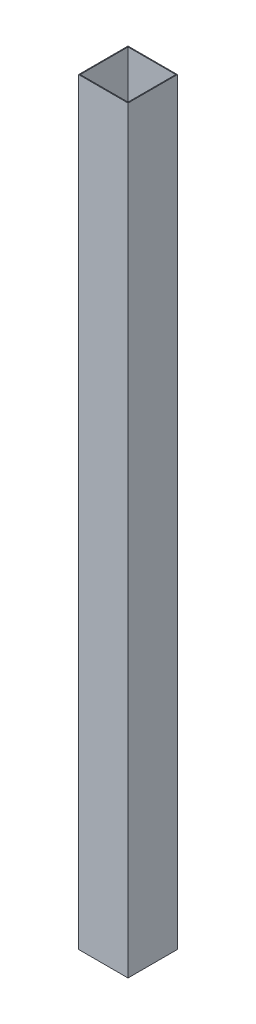
ISO-10303-21;
HEADER;
FILE_DESCRIPTION(('STEP AP214'),'2;1');
FILE_NAME('part.step','',(''),(''),'','','');
FILE_SCHEMA(('AUTOMOTIVE_DESIGN { 1 0 10303 214 1 1 1 1 }'));
ENDSEC;
DATA;
#1=APPLICATION_CONTEXT('core data for automotive mechanical design processes');
#2=APPLICATION_PROTOCOL_DEFINITION('international standard','automotive_design',2000,#1);
#3=PRODUCT_CONTEXT('',#1,'mechanical');
#4=PRODUCT('Part','Part','',(#3));
#5=PRODUCT_RELATED_PRODUCT_CATEGORY('part','',(#4));
#6=PRODUCT_DEFINITION_FORMATION('','',#4);
#7=PRODUCT_DEFINITION_CONTEXT('part definition',#1,'design');
#8=PRODUCT_DEFINITION('design','',#6,#7);
#9=PRODUCT_DEFINITION_SHAPE('','',#8);
#10=(LENGTH_UNIT() NAMED_UNIT(*) SI_UNIT(.MILLI.,.METRE.));
#11=(NAMED_UNIT(*) PLANE_ANGLE_UNIT() SI_UNIT($,.RADIAN.));
#12=(NAMED_UNIT(*) SI_UNIT($,.STERADIAN.) SOLID_ANGLE_UNIT());
#13=UNCERTAINTY_MEASURE_WITH_UNIT(LENGTH_MEASURE(1.E-05),#10,'distance_accuracy_value','');
#14=(GEOMETRIC_REPRESENTATION_CONTEXT(3) GLOBAL_UNCERTAINTY_ASSIGNED_CONTEXT((#13)) GLOBAL_UNIT_ASSIGNED_CONTEXT((#10,
#11,#12)) REPRESENTATION_CONTEXT('',''));
#15=CARTESIAN_POINT('',(0.,0.,0.));
#16=DIRECTION('',(0.,0.,1.));
#17=DIRECTION('',(1.,0.,0.));
#18=AXIS2_PLACEMENT_3D('',#15,#16,#17);
#19=CARTESIAN_POINT('',(0.,0.,0.));
#20=DIRECTION('',(0.,1.,0.));
#21=DIRECTION('',(0.,0.,1.));
#22=AXIS2_PLACEMENT_3D('',#19,#20,#21);
#23=PLANE('',#22);
#24=DIRECTION('',(0.,0.,-1.));
#25=VECTOR('',#24,1.);
#26=CARTESIAN_POINT('',(76.2,0.,-76.2));
#27=LINE('',#26,#25);
#28=CARTESIAN_POINT('',(76.2,0.,76.2));
#29=VERTEX_POINT('',#28);
#30=CARTESIAN_POINT('',(76.2,0.,-76.2));
#31=VERTEX_POINT('',#30);
#32=EDGE_CURVE('E145',#29,#31,#27,.T.);
#33=ORIENTED_EDGE('',*,*,#32,.F.);
#34=DIRECTION('',(1.,0.,0.));
#35=VECTOR('',#34,1.);
#36=CARTESIAN_POINT('',(-76.2,0.,76.2));
#37=LINE('',#36,#35);
#38=CARTESIAN_POINT('',(-76.2,0.,76.2));
#39=VERTEX_POINT('',#38);
#40=EDGE_CURVE('E136',#39,#29,#37,.T.);
#41=ORIENTED_EDGE('',*,*,#40,.F.);
#42=DIRECTION('',(0.,0.,1.));
#43=VECTOR('',#42,1.);
#44=CARTESIAN_POINT('',(-76.2,0.,-76.2));
#45=LINE('',#44,#43);
#46=CARTESIAN_POINT('',(-76.2,0.,-76.2));
#47=VERTEX_POINT('',#46);
#48=EDGE_CURVE('E140',#47,#39,#45,.T.);
#49=ORIENTED_EDGE('',*,*,#48,.F.);
#50=DIRECTION('',(-1.,0.,0.));
#51=VECTOR('',#50,1.);
#52=CARTESIAN_POINT('',(-76.2,0.,-76.2));
#53=LINE('',#52,#51);
#54=EDGE_CURVE('E125',#31,#47,#53,.T.);
#55=ORIENTED_EDGE('',*,*,#54,.F.);
#56=EDGE_LOOP('',(#33,#41,#49,#55));
#57=FACE_BOUND('',#56,.T.);
#58=DIRECTION('',(0.,0.,1.));
#59=VECTOR('',#58,1.);
#60=CARTESIAN_POINT('',(-73.66,0.,-73.66));
#61=LINE('',#60,#59);
#62=CARTESIAN_POINT('',(-73.66,0.,-73.66));
#63=VERTEX_POINT('',#62);
#64=CARTESIAN_POINT('',(-73.66,0.,73.66));
#65=VERTEX_POINT('',#64);
#66=EDGE_CURVE('E173',#63,#65,#61,.T.);
#67=ORIENTED_EDGE('',*,*,#66,.T.);
#68=DIRECTION('',(1.,0.,0.));
#69=VECTOR('',#68,1.);
#70=CARTESIAN_POINT('',(-73.66,0.,73.66));
#71=LINE('',#70,#69);
#72=CARTESIAN_POINT('',(73.66,0.,73.66));
#73=VERTEX_POINT('',#72);
#74=EDGE_CURVE('E169',#65,#73,#71,.T.);
#75=ORIENTED_EDGE('',*,*,#74,.T.);
#76=DIRECTION('',(0.,0.,-1.));
#77=VECTOR('',#76,1.);
#78=CARTESIAN_POINT('',(73.66,0.,-73.66));
#79=LINE('',#78,#77);
#80=CARTESIAN_POINT('',(73.66,0.,-73.66));
#81=VERTEX_POINT('',#80);
#82=EDGE_CURVE('E165',#73,#81,#79,.T.);
#83=ORIENTED_EDGE('',*,*,#82,.T.);
#84=DIRECTION('',(-1.,0.,0.));
#85=VECTOR('',#84,1.);
#86=CARTESIAN_POINT('',(-73.66,0.,-73.66));
#87=LINE('',#86,#85);
#88=EDGE_CURVE('E161',#81,#63,#87,.T.);
#89=ORIENTED_EDGE('',*,*,#88,.T.);
#90=EDGE_LOOP('',(#67,#75,#83,#89));
#91=FACE_BOUND('',#90,.T.);
#92=ADVANCED_FACE('F41',(#57,#91),#23,.F.);
#93=CARTESIAN_POINT('',(76.2,6019.8,-76.2));
#94=DIRECTION('',(-1.,0.,0.));
#95=DIRECTION('',(0.,0.,1.));
#96=AXIS2_PLACEMENT_3D('',#93,#94,#95);
#97=PLANE('',#96);
#98=DIRECTION('',(0.,-1.,0.));
#99=VECTOR('',#98,1.);
#100=CARTESIAN_POINT('',(76.2,6019.8,-76.2));
#101=LINE('',#100,#99);
#102=CARTESIAN_POINT('',(76.2,2336.8,-76.2));
#103=VERTEX_POINT('',#102);
#104=EDGE_CURVE('E50',#103,#31,#101,.T.);
#105=ORIENTED_EDGE('',*,*,#104,.F.);
#106=DIRECTION('',(0.,0.,1.));
#107=VECTOR('',#106,1.);
#108=CARTESIAN_POINT('',(76.2,2336.8,-76.2));
#109=LINE('',#108,#107);
#110=CARTESIAN_POINT('',(76.2,2336.8,76.2));
#111=VERTEX_POINT('',#110);
#112=EDGE_CURVE('E107',#103,#111,#109,.T.);
#113=ORIENTED_EDGE('',*,*,#112,.T.);
#114=DIRECTION('',(0.,-1.,0.));
#115=VECTOR('',#114,1.);
#116=CARTESIAN_POINT('',(76.2,6019.8,76.2));
#117=LINE('',#116,#115);
#118=EDGE_CURVE('E131',#111,#29,#117,.T.);
#119=ORIENTED_EDGE('',*,*,#118,.T.);
#120=ORIENTED_EDGE('',*,*,#32,.T.);
#121=EDGE_LOOP('',(#105,#113,#119,#120));
#122=FACE_BOUND('',#121,.T.);
#123=ADVANCED_FACE('F43',(#122),#97,.F.);
#124=CARTESIAN_POINT('',(-76.2,6019.8,-76.2));
#125=DIRECTION('',(0.,0.,1.));
#126=DIRECTION('',(1.,0.,0.));
#127=AXIS2_PLACEMENT_3D('',#124,#125,#126);
#128=PLANE('',#127);
#129=DIRECTION('',(0.,-1.,0.));
#130=VECTOR('',#129,1.);
#131=CARTESIAN_POINT('',(-76.2,6019.8,-76.2));
#132=LINE('',#131,#130);
#133=CARTESIAN_POINT('',(-76.1999999999996,2336.8,-76.2));
#134=VERTEX_POINT('',#133);
#135=EDGE_CURVE('E118',#134,#47,#132,.T.);
#136=ORIENTED_EDGE('',*,*,#135,.F.);
#137=DIRECTION('',(1.,0.,0.));
#138=VECTOR('',#137,1.);
#139=CARTESIAN_POINT('',(-76.1999999999996,2336.8,-76.2));
#140=LINE('',#139,#138);
#141=EDGE_CURVE('E104',#134,#103,#140,.T.);
#142=ORIENTED_EDGE('',*,*,#141,.T.);
#143=ORIENTED_EDGE('',*,*,#104,.T.);
#144=ORIENTED_EDGE('',*,*,#54,.T.);
#145=EDGE_LOOP('',(#136,#142,#143,#144));
#146=FACE_BOUND('',#145,.T.);
#147=ADVANCED_FACE('F123',(#146),#128,.F.);
#148=CARTESIAN_POINT('',(-76.2,6019.8,-76.2));
#149=DIRECTION('',(1.,0.,0.));
#150=DIRECTION('',(0.,0.,-1.));
#151=AXIS2_PLACEMENT_3D('',#148,#149,#150);
#152=PLANE('',#151);
#153=DIRECTION('',(0.,-1.,0.));
#154=VECTOR('',#153,1.);
#155=CARTESIAN_POINT('',(-76.2,6019.8,76.2));
#156=LINE('',#155,#154);
#157=CARTESIAN_POINT('',(-76.2,2336.8,76.2));
#158=VERTEX_POINT('',#157);
#159=EDGE_CURVE('E120',#158,#39,#156,.T.);
#160=ORIENTED_EDGE('',*,*,#159,.F.);
#161=DIRECTION('',(0.,0.,1.));
#162=VECTOR('',#161,1.);
#163=CARTESIAN_POINT('',(-76.1999999999996,2336.8,-76.2));
#164=LINE('',#163,#162);
#165=EDGE_CURVE('E57',#134,#158,#164,.T.);
#166=ORIENTED_EDGE('',*,*,#165,.F.);
#167=ORIENTED_EDGE('',*,*,#135,.T.);
#168=ORIENTED_EDGE('',*,*,#48,.T.);
#169=EDGE_LOOP('',(#160,#166,#167,#168));
#170=FACE_BOUND('',#169,.T.);
#171=ADVANCED_FACE('F116',(#170),#152,.F.);
#172=CARTESIAN_POINT('',(-76.2,6019.8,76.2));
#173=DIRECTION('',(0.,0.,-1.));
#174=DIRECTION('',(-1.,0.,0.));
#175=AXIS2_PLACEMENT_3D('',#172,#173,#174);
#176=PLANE('',#175);
#177=ORIENTED_EDGE('',*,*,#118,.F.);
#178=DIRECTION('',(1.,0.,0.));
#179=VECTOR('',#178,1.);
#180=CARTESIAN_POINT('',(-76.1999999999996,2336.8,76.2));
#181=LINE('',#180,#179);
#182=EDGE_CURVE('E112',#158,#111,#181,.T.);
#183=ORIENTED_EDGE('',*,*,#182,.F.);
#184=ORIENTED_EDGE('',*,*,#159,.T.);
#185=ORIENTED_EDGE('',*,*,#40,.T.);
#186=EDGE_LOOP('',(#177,#183,#184,#185));
#187=FACE_BOUND('',#186,.T.);
#188=ADVANCED_FACE('F191',(#187),#176,.F.);
#189=CARTESIAN_POINT('',(-73.66,6019.8,-73.66));
#190=DIRECTION('',(1.,0.,0.));
#191=DIRECTION('',(0.,0.,-1.));
#192=AXIS2_PLACEMENT_3D('',#189,#190,#191);
#193=PLANE('',#192);
#194=DIRECTION('',(0.,0.,-1.));
#195=VECTOR('',#194,1.);
#196=CARTESIAN_POINT('',(-73.66,2336.8,-73.66));
#197=LINE('',#196,#195);
#198=CARTESIAN_POINT('',(-73.66,2336.8,73.66));
#199=VERTEX_POINT('',#198);
#200=CARTESIAN_POINT('',(-73.66,2336.8,-73.66));
#201=VERTEX_POINT('',#200);
#202=EDGE_CURVE('E64',#199,#201,#197,.T.);
#203=ORIENTED_EDGE('',*,*,#202,.F.);
#204=DIRECTION('',(0.,-1.,0.));
#205=VECTOR('',#204,1.);
#206=CARTESIAN_POINT('',(-73.66,6019.8,73.66));
#207=LINE('',#206,#205);
#208=EDGE_CURVE('E149',#199,#65,#207,.T.);
#209=ORIENTED_EDGE('',*,*,#208,.T.);
#210=ORIENTED_EDGE('',*,*,#66,.F.);
#211=DIRECTION('',(0.,-1.,0.));
#212=VECTOR('',#211,1.);
#213=CARTESIAN_POINT('',(-73.66,6019.8,-73.66));
#214=LINE('',#213,#212);
#215=EDGE_CURVE('E158',#201,#63,#214,.T.);
#216=ORIENTED_EDGE('',*,*,#215,.F.);
#217=EDGE_LOOP('',(#203,#209,#210,#216));
#218=FACE_BOUND('',#217,.T.);
#219=ADVANCED_FACE('F203',(#218),#193,.T.);
#220=CARTESIAN_POINT('',(-73.66,6019.8,73.66));
#221=DIRECTION('',(0.,0.,-1.));
#222=DIRECTION('',(-1.,0.,0.));
#223=AXIS2_PLACEMENT_3D('',#220,#221,#222);
#224=PLANE('',#223);
#225=DIRECTION('',(-1.,0.,0.));
#226=VECTOR('',#225,1.);
#227=CARTESIAN_POINT('',(-73.66,2336.8,73.66));
#228=LINE('',#227,#226);
#229=CARTESIAN_POINT('',(73.66,2336.8,73.66));
#230=VERTEX_POINT('',#229);
#231=EDGE_CURVE('E179',#230,#199,#228,.T.);
#232=ORIENTED_EDGE('',*,*,#231,.F.);
#233=DIRECTION('',(0.,-1.,0.));
#234=VECTOR('',#233,1.);
#235=CARTESIAN_POINT('',(73.66,6019.8,73.66));
#236=LINE('',#235,#234);
#237=EDGE_CURVE('E152',#230,#73,#236,.T.);
#238=ORIENTED_EDGE('',*,*,#237,.T.);
#239=ORIENTED_EDGE('',*,*,#74,.F.);
#240=ORIENTED_EDGE('',*,*,#208,.F.);
#241=EDGE_LOOP('',(#232,#238,#239,#240));
#242=FACE_BOUND('',#241,.T.);
#243=ADVANCED_FACE('F207',(#242),#224,.T.);
#244=CARTESIAN_POINT('',(73.66,6019.8,-73.66));
#245=DIRECTION('',(-1.,0.,0.));
#246=DIRECTION('',(0.,0.,1.));
#247=AXIS2_PLACEMENT_3D('',#244,#245,#246);
#248=PLANE('',#247);
#249=DIRECTION('',(0.,0.,1.));
#250=VECTOR('',#249,1.);
#251=CARTESIAN_POINT('',(73.66,2336.8,-73.66));
#252=LINE('',#251,#250);
#253=CARTESIAN_POINT('',(73.66,2336.8,-73.66));
#254=VERTEX_POINT('',#253);
#255=EDGE_CURVE('E182',#254,#230,#252,.T.);
#256=ORIENTED_EDGE('',*,*,#255,.F.);
#257=DIRECTION('',(0.,-1.,0.));
#258=VECTOR('',#257,1.);
#259=CARTESIAN_POINT('',(73.66,6019.8,-73.66));
#260=LINE('',#259,#258);
#261=EDGE_CURVE('E155',#254,#81,#260,.T.);
#262=ORIENTED_EDGE('',*,*,#261,.T.);
#263=ORIENTED_EDGE('',*,*,#82,.F.);
#264=ORIENTED_EDGE('',*,*,#237,.F.);
#265=EDGE_LOOP('',(#256,#262,#263,#264));
#266=FACE_BOUND('',#265,.T.);
#267=ADVANCED_FACE('F212',(#266),#248,.T.);
#268=CARTESIAN_POINT('',(-73.66,6019.8,-73.66));
#269=DIRECTION('',(0.,0.,1.));
#270=DIRECTION('',(1.,0.,0.));
#271=AXIS2_PLACEMENT_3D('',#268,#269,#270);
#272=PLANE('',#271);
#273=DIRECTION('',(1.,0.,0.));
#274=VECTOR('',#273,1.);
#275=CARTESIAN_POINT('',(-73.66,2336.8,-73.66));
#276=LINE('',#275,#274);
#277=EDGE_CURVE('E11',#201,#254,#276,.T.);
#278=ORIENTED_EDGE('',*,*,#277,.F.);
#279=ORIENTED_EDGE('',*,*,#215,.T.);
#280=ORIENTED_EDGE('',*,*,#88,.F.);
#281=ORIENTED_EDGE('',*,*,#261,.F.);
#282=EDGE_LOOP('',(#278,#279,#280,#281));
#283=FACE_BOUND('',#282,.T.);
#284=ADVANCED_FACE('F215',(#283),#272,.T.);
#285=CARTESIAN_POINT('',(-76.1999999999996,2336.8,-76.2));
#286=DIRECTION('',(0.,-1.,0.));
#287=DIRECTION('',(0.,0.,-1.));
#288=AXIS2_PLACEMENT_3D('',#285,#286,#287);
#289=PLANE('',#288);
#290=ORIENTED_EDGE('',*,*,#202,.T.);
#291=ORIENTED_EDGE('',*,*,#277,.T.);
#292=ORIENTED_EDGE('',*,*,#255,.T.);
#293=ORIENTED_EDGE('',*,*,#231,.T.);
#294=EDGE_LOOP('',(#290,#291,#292,#293));
#295=FACE_BOUND('',#294,.T.);
#296=ORIENTED_EDGE('',*,*,#182,.T.);
#297=ORIENTED_EDGE('',*,*,#112,.F.);
#298=ORIENTED_EDGE('',*,*,#141,.F.);
#299=ORIENTED_EDGE('',*,*,#165,.T.);
#300=EDGE_LOOP('',(#296,#297,#298,#299));
#301=FACE_BOUND('',#300,.T.);
#302=ADVANCED_FACE('F105',(#295,#301),#289,.F.);
#303=CLOSED_SHELL('',(#92,#123,#147,#171,#188,#219,#243,#267,#284,#302));
#304=MANIFOLD_SOLID_BREP('B2',#303);
#305=ADVANCED_BREP_SHAPE_REPRESENTATION('',(#18,#304),#14);
#306=SHAPE_DEFINITION_REPRESENTATION(#9,#305);
ENDSEC;
END-ISO-10303-21;
